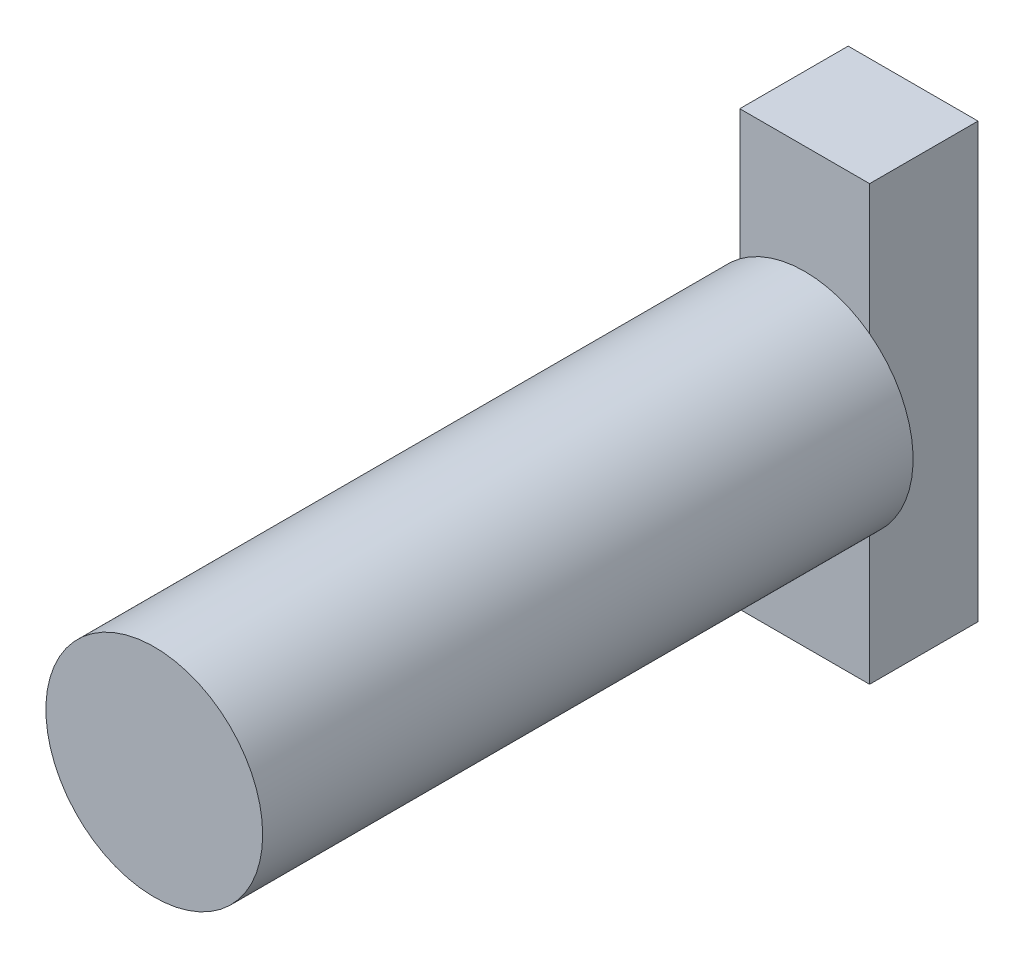
ISO-10303-21;
HEADER;
FILE_DESCRIPTION(('STEP AP214'),'2;1');
FILE_NAME('part.step','',(''),(''),'','','');
FILE_SCHEMA(('AUTOMOTIVE_DESIGN { 1 0 10303 214 1 1 1 1 }'));
ENDSEC;
DATA;
#1=APPLICATION_CONTEXT('core data for automotive mechanical design processes');
#2=APPLICATION_PROTOCOL_DEFINITION('international standard','automotive_design',2000,#1);
#3=PRODUCT_CONTEXT('',#1,'mechanical');
#4=PRODUCT('Part','Part','',(#3));
#5=PRODUCT_RELATED_PRODUCT_CATEGORY('part','',(#4));
#6=PRODUCT_DEFINITION_FORMATION('','',#4);
#7=PRODUCT_DEFINITION_CONTEXT('part definition',#1,'design');
#8=PRODUCT_DEFINITION('design','',#6,#7);
#9=PRODUCT_DEFINITION_SHAPE('','',#8);
#10=(LENGTH_UNIT() NAMED_UNIT(*) SI_UNIT(.MILLI.,.METRE.));
#11=(NAMED_UNIT(*) PLANE_ANGLE_UNIT() SI_UNIT($,.RADIAN.));
#12=(NAMED_UNIT(*) SI_UNIT($,.STERADIAN.) SOLID_ANGLE_UNIT());
#13=UNCERTAINTY_MEASURE_WITH_UNIT(LENGTH_MEASURE(1.E-05),#10,'distance_accuracy_value','');
#14=(GEOMETRIC_REPRESENTATION_CONTEXT(3) GLOBAL_UNCERTAINTY_ASSIGNED_CONTEXT((#13)) GLOBAL_UNIT_ASSIGNED_CONTEXT((#10,
#11,#12)) REPRESENTATION_CONTEXT('',''));
#15=CARTESIAN_POINT('',(0.,0.,0.));
#16=DIRECTION('',(0.,0.,1.));
#17=DIRECTION('',(1.,0.,0.));
#18=AXIS2_PLACEMENT_3D('',#15,#16,#17);
#19=CARTESIAN_POINT('',(0.,0.,30.));
#20=DIRECTION('',(0.,0.,-1.));
#21=DIRECTION('',(-1.,0.,0.));
#22=AXIS2_PLACEMENT_3D('',#19,#20,#21);
#23=CYLINDRICAL_SURFACE('',#22,5.);
#24=CARTESIAN_POINT('',(0.,0.,30.));
#25=DIRECTION('',(0.,0.,1.));
#26=DIRECTION('',(1.,0.,0.));
#27=AXIS2_PLACEMENT_3D('',#24,#25,#26);
#28=CIRCLE('',#27,5.);
#29=CARTESIAN_POINT('',(5.,0.,30.));
#30=VERTEX_POINT('',#29);
#31=EDGE_CURVE('E130',#30,#30,#28,.T.);
#32=ORIENTED_EDGE('',*,*,#31,.F.);
#33=EDGE_LOOP('',(#32));
#34=FACE_BOUND('',#33,.T.);
#35=CARTESIAN_POINT('',(0.,0.,0.));
#36=DIRECTION('',(0.,0.,1.));
#37=DIRECTION('',(1.,0.,0.));
#38=AXIS2_PLACEMENT_3D('',#35,#36,#37);
#39=CIRCLE('',#38,5.);
#40=CARTESIAN_POINT('',(4.99399749142711,0.244926633136775,0.));
#41=VERTEX_POINT('',#40);
#42=CARTESIAN_POINT('',(2.99399749142711,4.00449485220398,0.));
#43=VERTEX_POINT('',#42);
#44=EDGE_CURVE('E134',#41,#43,#39,.T.);
#45=ORIENTED_EDGE('',*,*,#44,.T.);
#46=CARTESIAN_POINT('',(-2.99399749142711,4.00449485220398,0.));
#47=VERTEX_POINT('',#46);
#48=EDGE_CURVE('E138',#43,#47,#39,.T.);
#49=ORIENTED_EDGE('',*,*,#48,.T.);
#50=CARTESIAN_POINT('',(0.,0.,0.));
#51=DIRECTION('',(0.,0.,1.));
#52=DIRECTION('',(1.,0.,0.));
#53=AXIS2_PLACEMENT_3D('',#50,#51,#52);
#54=CIRCLE('',#53,5.);
#55=CARTESIAN_POINT('',(-4.99399749142711,0.244926633136775,0.));
#56=VERTEX_POINT('',#55);
#57=EDGE_CURVE('E126',#47,#56,#54,.T.);
#58=ORIENTED_EDGE('',*,*,#57,.T.);
#59=CARTESIAN_POINT('',(-4.99399749142711,-0.24492663313681,0.));
#60=DIRECTION('',(0.,1.,0.));
#61=VECTOR('',#60,1.);
#62=LINE('',#59,#61);
#63=CARTESIAN_POINT('',(-4.99399749142711,-0.24492663313681,0.));
#64=VERTEX_POINT('',#63);
#65=EDGE_CURVE('E44',#64,#56,#62,.T.);
#66=ORIENTED_EDGE('',*,*,#65,.F.);
#67=CARTESIAN_POINT('',(-2.99399749142711,-4.00449485220398,0.));
#68=VERTEX_POINT('',#67);
#69=EDGE_CURVE('E139',#64,#68,#39,.T.);
#70=ORIENTED_EDGE('',*,*,#69,.T.);
#71=CARTESIAN_POINT('',(2.99399749142711,-4.00449485220398,0.));
#72=VERTEX_POINT('',#71);
#73=EDGE_CURVE('E150',#68,#72,#39,.T.);
#74=ORIENTED_EDGE('',*,*,#73,.T.);
#75=CARTESIAN_POINT('',(4.99399749142711,-0.244926633136733,0.));
#76=VERTEX_POINT('',#75);
#77=EDGE_CURVE('E153',#72,#76,#39,.T.);
#78=ORIENTED_EDGE('',*,*,#77,.T.);
#79=CARTESIAN_POINT('',(4.99399749142711,0.244926633136775,0.));
#80=DIRECTION('',(0.,-1.,0.));
#81=VECTOR('',#80,1.);
#82=LINE('',#79,#81);
#83=EDGE_CURVE('E133',#41,#76,#82,.T.);
#84=ORIENTED_EDGE('',*,*,#83,.F.);
#85=EDGE_LOOP('',(#45,#49,#58,#66,#70,#74,#78,#84));
#86=FACE_BOUND('',#85,.T.);
#87=ADVANCED_FACE('F33',(#34,#86),#23,.T.);
#88=CARTESIAN_POINT('',(0.,0.,30.));
#89=DIRECTION('',(0.,0.,1.));
#90=DIRECTION('',(1.,0.,0.));
#91=AXIS2_PLACEMENT_3D('',#88,#89,#90);
#92=PLANE('',#91);
#93=ORIENTED_EDGE('',*,*,#31,.T.);
#94=EDGE_LOOP('',(#93));
#95=FACE_BOUND('',#94,.T.);
#96=ADVANCED_FACE('F190',(#95),#92,.T.);
#97=CARTESIAN_POINT('',(0.,0.,0.));
#98=DIRECTION('',(0.,0.,-1.));
#99=DIRECTION('',(-1.,0.,0.));
#100=AXIS2_PLACEMENT_3D('',#97,#98,#99);
#101=PLANE('',#100);
#102=ORIENTED_EDGE('',*,*,#48,.F.);
#103=DIRECTION('',(0.,1.,0.));
#104=VECTOR('',#103,1.);
#105=CARTESIAN_POINT('',(2.99399749142711,10.,0.));
#106=LINE('',#105,#104);
#107=CARTESIAN_POINT('',(2.99399749142711,10.,0.));
#108=VERTEX_POINT('',#107);
#109=EDGE_CURVE('E109',#43,#108,#106,.T.);
#110=ORIENTED_EDGE('',*,*,#109,.T.);
#111=DIRECTION('',(1.,0.,0.));
#112=VECTOR('',#111,1.);
#113=CARTESIAN_POINT('',(4.99399749142711,10.,0.));
#114=LINE('',#113,#112);
#115=CARTESIAN_POINT('',(-2.99399749142711,10.,0.));
#116=VERTEX_POINT('',#115);
#117=EDGE_CURVE('E121',#116,#108,#114,.T.);
#118=ORIENTED_EDGE('',*,*,#117,.F.);
#119=DIRECTION('',(0.,-1.,0.));
#120=VECTOR('',#119,1.);
#121=CARTESIAN_POINT('',(-2.99399749142711,10.,0.));
#122=LINE('',#121,#120);
#123=EDGE_CURVE('E206',#116,#47,#122,.T.);
#124=ORIENTED_EDGE('',*,*,#123,.T.);
#125=EDGE_LOOP('',(#102,#110,#118,#124));
#126=FACE_BOUND('',#125,.T.);
#127=ADVANCED_FACE('F184',(#126),#101,.F.);
#128=CARTESIAN_POINT('',(4.99399749142711,10.,-5.));
#129=DIRECTION('',(0.,-1.,0.));
#130=DIRECTION('',(0.,0.,-1.));
#131=AXIS2_PLACEMENT_3D('',#128,#129,#130);
#132=PLANE('',#131);
#133=ORIENTED_EDGE('',*,*,#117,.T.);
#134=DIRECTION('',(0.,0.,-1.));
#135=VECTOR('',#134,1.);
#136=CARTESIAN_POINT('',(2.99399749142711,10.,0.));
#137=LINE('',#136,#135);
#138=CARTESIAN_POINT('',(2.99399749142711,10.,-5.));
#139=VERTEX_POINT('',#138);
#140=EDGE_CURVE('E117',#108,#139,#137,.T.);
#141=ORIENTED_EDGE('',*,*,#140,.T.);
#142=DIRECTION('',(1.,0.,0.));
#143=VECTOR('',#142,1.);
#144=CARTESIAN_POINT('',(4.99399749142711,10.,-5.));
#145=LINE('',#144,#143);
#146=CARTESIAN_POINT('',(-2.99399749142711,10.,-5.));
#147=VERTEX_POINT('',#146);
#148=EDGE_CURVE('E120',#147,#139,#145,.T.);
#149=ORIENTED_EDGE('',*,*,#148,.F.);
#150=DIRECTION('',(0.,0.,-1.));
#151=VECTOR('',#150,1.);
#152=CARTESIAN_POINT('',(-2.99399749142711,10.,0.));
#153=LINE('',#152,#151);
#154=EDGE_CURVE('E209',#116,#147,#153,.T.);
#155=ORIENTED_EDGE('',*,*,#154,.F.);
#156=EDGE_LOOP('',(#133,#141,#149,#155));
#157=FACE_BOUND('',#156,.T.);
#158=ADVANCED_FACE('F187',(#157),#132,.F.);
#159=CARTESIAN_POINT('',(4.99399749142711,-10.,-5.));
#160=DIRECTION('',(0.,1.,0.));
#161=DIRECTION('',(0.,0.,1.));
#162=AXIS2_PLACEMENT_3D('',#159,#160,#161);
#163=PLANE('',#162);
#164=DIRECTION('',(-1.,0.,0.));
#165=VECTOR('',#164,1.);
#166=CARTESIAN_POINT('',(4.99399749142711,-10.,-5.));
#167=LINE('',#166,#165);
#168=CARTESIAN_POINT('',(2.99399749142711,-10.,-5.));
#169=VERTEX_POINT('',#168);
#170=CARTESIAN_POINT('',(-2.99399749142711,-10.,-5.));
#171=VERTEX_POINT('',#170);
#172=EDGE_CURVE('E116',#169,#171,#167,.T.);
#173=ORIENTED_EDGE('',*,*,#172,.F.);
#174=DIRECTION('',(0.,0.,-1.));
#175=VECTOR('',#174,1.);
#176=CARTESIAN_POINT('',(2.99399749142711,-10.,0.));
#177=LINE('',#176,#175);
#178=CARTESIAN_POINT('',(2.99399749142711,-10.,0.));
#179=VERTEX_POINT('',#178);
#180=EDGE_CURVE('E102',#179,#169,#177,.T.);
#181=ORIENTED_EDGE('',*,*,#180,.F.);
#182=DIRECTION('',(-1.,0.,0.));
#183=VECTOR('',#182,1.);
#184=CARTESIAN_POINT('',(4.99399749142711,-10.,0.));
#185=LINE('',#184,#183);
#186=CARTESIAN_POINT('',(-2.99399749142711,-10.,0.));
#187=VERTEX_POINT('',#186);
#188=EDGE_CURVE('E114',#179,#187,#185,.T.);
#189=ORIENTED_EDGE('',*,*,#188,.T.);
#190=DIRECTION('',(0.,0.,-1.));
#191=VECTOR('',#190,1.);
#192=CARTESIAN_POINT('',(-2.99399749142711,-10.,0.));
#193=LINE('',#192,#191);
#194=EDGE_CURVE('E52',#187,#171,#193,.T.);
#195=ORIENTED_EDGE('',*,*,#194,.T.);
#196=EDGE_LOOP('',(#173,#181,#189,#195));
#197=FACE_BOUND('',#196,.T.);
#198=ADVANCED_FACE('F113',(#197),#163,.F.);
#199=CARTESIAN_POINT('',(0.,0.,-5.));
#200=DIRECTION('',(0.,0.,-1.));
#201=DIRECTION('',(-1.,0.,0.));
#202=AXIS2_PLACEMENT_3D('',#199,#200,#201);
#203=PLANE('',#202);
#204=DIRECTION('',(0.,1.,0.));
#205=VECTOR('',#204,1.);
#206=CARTESIAN_POINT('',(2.99399749142711,10.,-5.));
#207=LINE('',#206,#205);
#208=EDGE_CURVE('E218',#169,#139,#207,.T.);
#209=ORIENTED_EDGE('',*,*,#208,.F.);
#210=ORIENTED_EDGE('',*,*,#172,.T.);
#211=DIRECTION('',(0.,-1.,0.));
#212=VECTOR('',#211,1.);
#213=CARTESIAN_POINT('',(-2.99399749142711,10.,-5.));
#214=LINE('',#213,#212);
#215=EDGE_CURVE('E214',#147,#171,#214,.T.);
#216=ORIENTED_EDGE('',*,*,#215,.F.);
#217=ORIENTED_EDGE('',*,*,#148,.T.);
#218=EDGE_LOOP('',(#209,#210,#216,#217));
#219=FACE_BOUND('',#218,.T.);
#220=ADVANCED_FACE('F178',(#219),#203,.T.);
#221=ORIENTED_EDGE('',*,*,#188,.F.);
#222=EDGE_CURVE('E99',#179,#72,#106,.T.);
#223=ORIENTED_EDGE('',*,*,#222,.T.);
#224=ORIENTED_EDGE('',*,*,#73,.F.);
#225=DIRECTION('',(0.,-1.,0.));
#226=VECTOR('',#225,1.);
#227=CARTESIAN_POINT('',(-2.99399749142711,0.,0.));
#228=LINE('',#227,#226);
#229=EDGE_CURVE('E11',#68,#187,#228,.T.);
#230=ORIENTED_EDGE('',*,*,#229,.T.);
#231=EDGE_LOOP('',(#221,#223,#224,#230));
#232=FACE_BOUND('',#231,.T.);
#233=ADVANCED_FACE('F119',(#232),#101,.F.);
#234=CARTESIAN_POINT('',(0.,0.,0.));
#235=DIRECTION('',(0.,0.,1.));
#236=DIRECTION('',(1.,0.,0.));
#237=AXIS2_PLACEMENT_3D('',#234,#235,#236);
#238=PLANE('',#237);
#239=EDGE_CURVE('E210',#47,#68,#122,.T.);
#240=ORIENTED_EDGE('',*,*,#239,.T.);
#241=ORIENTED_EDGE('',*,*,#69,.F.);
#242=ORIENTED_EDGE('',*,*,#65,.T.);
#243=ORIENTED_EDGE('',*,*,#57,.F.);
#244=EDGE_LOOP('',(#240,#241,#242,#243));
#245=FACE_BOUND('',#244,.T.);
#246=ADVANCED_FACE('F164',(#245),#238,.F.);
#247=CARTESIAN_POINT('',(-2.99399749142711,10.,0.));
#248=DIRECTION('',(1.,0.,0.));
#249=DIRECTION('',(0.,1.,0.));
#250=AXIS2_PLACEMENT_3D('',#247,#248,#249);
#251=PLANE('',#250);
#252=ORIENTED_EDGE('',*,*,#215,.T.);
#253=ORIENTED_EDGE('',*,*,#194,.F.);
#254=ORIENTED_EDGE('',*,*,#229,.F.);
#255=ORIENTED_EDGE('',*,*,#239,.F.);
#256=ORIENTED_EDGE('',*,*,#123,.F.);
#257=ORIENTED_EDGE('',*,*,#154,.T.);
#258=EDGE_LOOP('',(#252,#253,#254,#255,#256,#257));
#259=FACE_BOUND('',#258,.T.);
#260=ADVANCED_FACE('F174',(#259),#251,.F.);
#261=CARTESIAN_POINT('',(0.,0.,0.));
#262=DIRECTION('',(0.,0.,-1.));
#263=DIRECTION('',(-1.,0.,0.));
#264=AXIS2_PLACEMENT_3D('',#261,#262,#263);
#265=PLANE('',#264);
#266=ORIENTED_EDGE('',*,*,#44,.F.);
#267=ORIENTED_EDGE('',*,*,#83,.T.);
#268=ORIENTED_EDGE('',*,*,#77,.F.);
#269=EDGE_CURVE('E59',#72,#43,#106,.T.);
#270=ORIENTED_EDGE('',*,*,#269,.T.);
#271=EDGE_LOOP('',(#266,#267,#268,#270));
#272=FACE_BOUND('',#271,.T.);
#273=ADVANCED_FACE('F177',(#272),#265,.T.);
#274=CARTESIAN_POINT('',(2.99399749142711,10.,0.));
#275=DIRECTION('',(-1.,0.,0.));
#276=DIRECTION('',(0.,-1.,0.));
#277=AXIS2_PLACEMENT_3D('',#274,#275,#276);
#278=PLANE('',#277);
#279=ORIENTED_EDGE('',*,*,#208,.T.);
#280=ORIENTED_EDGE('',*,*,#140,.F.);
#281=ORIENTED_EDGE('',*,*,#109,.F.);
#282=ORIENTED_EDGE('',*,*,#269,.F.);
#283=ORIENTED_EDGE('',*,*,#222,.F.);
#284=ORIENTED_EDGE('',*,*,#180,.T.);
#285=EDGE_LOOP('',(#279,#280,#281,#282,#283,#284));
#286=FACE_BOUND('',#285,.T.);
#287=ADVANCED_FACE('F101',(#286),#278,.F.);
#288=CLOSED_SHELL('',(#87,#96,#127,#158,#198,#220,#233,#246,#260,#273,#287));
#289=MANIFOLD_SOLID_BREP('B2',#288);
#290=ADVANCED_BREP_SHAPE_REPRESENTATION('',(#18,#289),#14);
#291=SHAPE_DEFINITION_REPRESENTATION(#9,#290);
ENDSEC;
END-ISO-10303-21;
